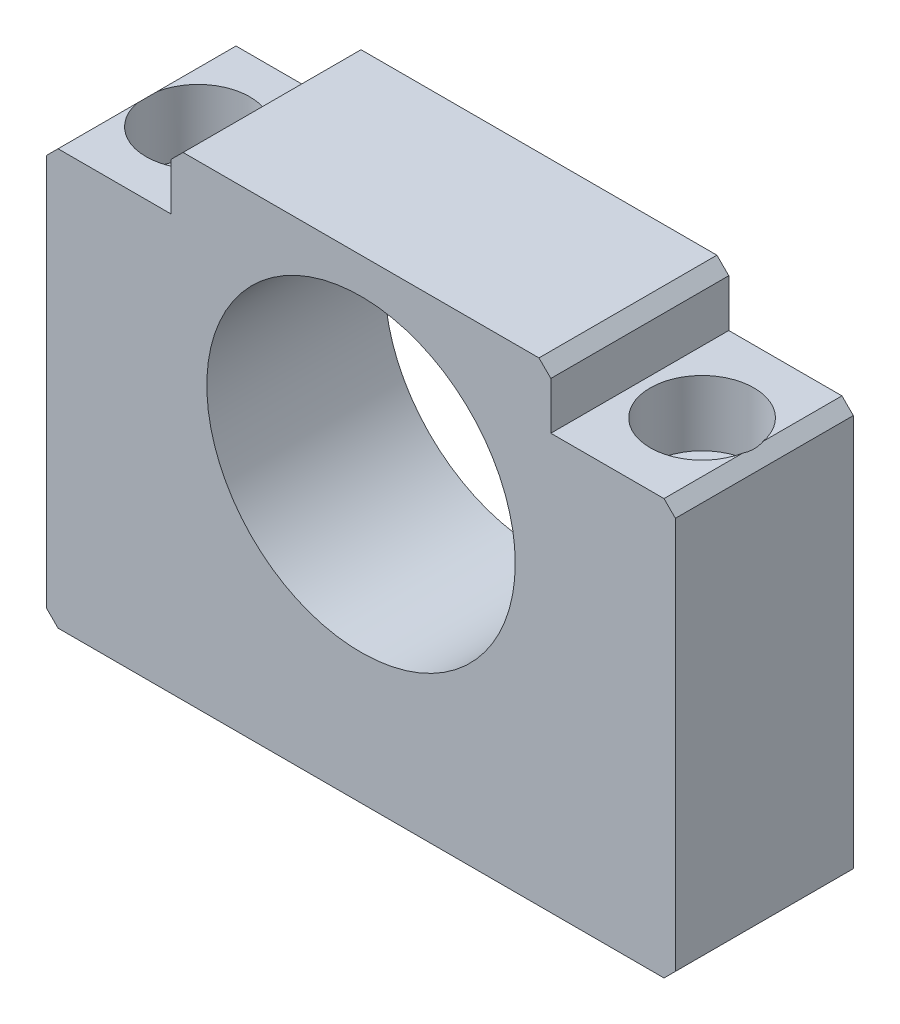
ISO-10303-21;
HEADER;
FILE_DESCRIPTION(('STEP AP214'),'2;1');
FILE_NAME('part.step','',(''),(''),'','','');
FILE_SCHEMA(('AUTOMOTIVE_DESIGN { 1 0 10303 214 1 1 1 1 }'));
ENDSEC;
DATA;
#1=APPLICATION_CONTEXT('core data for automotive mechanical design processes');
#2=APPLICATION_PROTOCOL_DEFINITION('international standard','automotive_design',2000,#1);
#3=PRODUCT_CONTEXT('',#1,'mechanical');
#4=PRODUCT('Part','Part','',(#3));
#5=PRODUCT_RELATED_PRODUCT_CATEGORY('part','',(#4));
#6=PRODUCT_DEFINITION_FORMATION('','',#4);
#7=PRODUCT_DEFINITION_CONTEXT('part definition',#1,'design');
#8=PRODUCT_DEFINITION('design','',#6,#7);
#9=PRODUCT_DEFINITION_SHAPE('','',#8);
#10=(LENGTH_UNIT() NAMED_UNIT(*) SI_UNIT(.MILLI.,.METRE.));
#11=(NAMED_UNIT(*) PLANE_ANGLE_UNIT() SI_UNIT($,.RADIAN.));
#12=(NAMED_UNIT(*) SI_UNIT($,.STERADIAN.) SOLID_ANGLE_UNIT());
#13=UNCERTAINTY_MEASURE_WITH_UNIT(LENGTH_MEASURE(1.E-05),#10,'distance_accuracy_value','');
#14=(GEOMETRIC_REPRESENTATION_CONTEXT(3) GLOBAL_UNCERTAINTY_ASSIGNED_CONTEXT((#13)) GLOBAL_UNIT_ASSIGNED_CONTEXT((#10,
#11,#12)) REPRESENTATION_CONTEXT('',''));
#15=CARTESIAN_POINT('',(0.,0.,0.));
#16=DIRECTION('',(0.,0.,1.));
#17=DIRECTION('',(1.,0.,0.));
#18=AXIS2_PLACEMENT_3D('',#15,#16,#17);
#19=CARTESIAN_POINT('',(-51.08,-48.,-30.));
#20=DIRECTION('',(0.,-1.,0.));
#21=DIRECTION('',(0.,0.,-1.));
#22=AXIS2_PLACEMENT_3D('',#19,#20,#21);
#23=PLANE('',#22);
#24=CARTESIAN_POINT('',(42.5,-48.,-15.));
#25=DIRECTION('',(0.,1.,0.));
#26=DIRECTION('',(0.,0.,1.));
#27=AXIS2_PLACEMENT_3D('',#24,#25,#26);
#28=CIRCLE('',#27,5.5);
#29=CARTESIAN_POINT('',(42.5,-48.,-9.5));
#30=VERTEX_POINT('',#29);
#31=EDGE_CURVE('E155',#30,#30,#28,.T.);
#32=ORIENTED_EDGE('',*,*,#31,.T.);
#33=EDGE_LOOP('',(#32));
#34=FACE_BOUND('',#33,.T.);
#35=DIRECTION('',(1.,0.,0.));
#36=VECTOR('',#35,1.);
#37=CARTESIAN_POINT('',(-51.08,-48.,0.));
#38=LINE('',#37,#36);
#39=CARTESIAN_POINT('',(-51.08,-48.,0.));
#40=VERTEX_POINT('',#39);
#41=CARTESIAN_POINT('',(51.08,-48.,0.));
#42=VERTEX_POINT('',#41);
#43=EDGE_CURVE('E285',#40,#42,#38,.T.);
#44=ORIENTED_EDGE('',*,*,#43,.F.);
#45=DIRECTION('',(0.,0.,1.));
#46=VECTOR('',#45,1.);
#47=CARTESIAN_POINT('',(-51.08,-48.,-30.));
#48=LINE('',#47,#46);
#49=CARTESIAN_POINT('',(-51.08,-48.,-30.));
#50=VERTEX_POINT('',#49);
#51=EDGE_CURVE('E189',#50,#40,#48,.T.);
#52=ORIENTED_EDGE('',*,*,#51,.F.);
#53=DIRECTION('',(1.,0.,0.));
#54=VECTOR('',#53,1.);
#55=CARTESIAN_POINT('',(-51.08,-48.,-30.));
#56=LINE('',#55,#54);
#57=CARTESIAN_POINT('',(51.08,-48.,-30.));
#58=VERTEX_POINT('',#57);
#59=EDGE_CURVE('E246',#50,#58,#56,.T.);
#60=ORIENTED_EDGE('',*,*,#59,.T.);
#61=DIRECTION('',(0.,0.,1.));
#62=VECTOR('',#61,1.);
#63=CARTESIAN_POINT('',(51.08,-48.,-30.));
#64=LINE('',#63,#62);
#65=EDGE_CURVE('E187',#58,#42,#64,.T.);
#66=ORIENTED_EDGE('',*,*,#65,.T.);
#67=EDGE_LOOP('',(#44,#52,#60,#66));
#68=FACE_BOUND('',#67,.T.);
#69=CARTESIAN_POINT('',(-42.5,-48.,-15.));
#70=DIRECTION('',(0.,1.,0.));
#71=DIRECTION('',(0.,0.,1.));
#72=AXIS2_PLACEMENT_3D('',#69,#70,#71);
#73=CIRCLE('',#72,5.5);
#74=CARTESIAN_POINT('',(-42.5,-48.,-9.5));
#75=VERTEX_POINT('',#74);
#76=EDGE_CURVE('E332',#75,#75,#73,.T.);
#77=ORIENTED_EDGE('',*,*,#76,.T.);
#78=EDGE_LOOP('',(#77));
#79=FACE_BOUND('',#78,.T.);
#80=ADVANCED_FACE('F34',(#34,#68,#79),#23,.T.);
#81=CARTESIAN_POINT('',(-51.08,22.,-30.));
#82=DIRECTION('',(-0.707106781186547,0.707106781186547,0.));
#83=DIRECTION('',(-0.707106781186548,-0.707106781186548,0.));
#84=AXIS2_PLACEMENT_3D('',#81,#82,#83);
#85=PLANE('',#84);
#86=DIRECTION('',(0.,0.,1.));
#87=VECTOR('',#86,1.);
#88=CARTESIAN_POINT('',(-51.08,22.,-30.));
#89=LINE('',#88,#87);
#90=CARTESIAN_POINT('',(-51.08,22.,-13.2835793056479));
#91=VERTEX_POINT('',#90);
#92=CARTESIAN_POINT('',(-51.08,22.,0.));
#93=VERTEX_POINT('',#92);
#94=EDGE_CURVE('E154',#91,#93,#89,.T.);
#95=ORIENTED_EDGE('',*,*,#94,.F.);
#96=CARTESIAN_POINT('',(-42.5,30.58,-15.));
#97=DIRECTION('',(-0.707106781186547,0.707106781186547,0.));
#98=DIRECTION('',(0.707106781186548,0.707106781186548,0.));
#99=AXIS2_PLACEMENT_3D('',#96,#97,#98);
#100=ELLIPSE('',#99,12.3743686707646,8.75);
#101=CARTESIAN_POINT('',(-51.08,22.,-16.7164206943521));
#102=VERTEX_POINT('',#101);
#103=EDGE_CURVE('E48',#91,#102,#100,.F.);
#104=ORIENTED_EDGE('',*,*,#103,.T.);
#105=CARTESIAN_POINT('',(-51.08,22.,-30.));
#106=VERTEX_POINT('',#105);
#107=EDGE_CURVE('E151',#106,#102,#89,.T.);
#108=ORIENTED_EDGE('',*,*,#107,.F.);
#109=DIRECTION('',(-0.707106781186548,-0.707106781186548,0.));
#110=VECTOR('',#109,1.);
#111=CARTESIAN_POINT('',(-51.08,22.,-30.));
#112=LINE('',#111,#110);
#113=CARTESIAN_POINT('',(-53.,20.08,-30.));
#114=VERTEX_POINT('',#113);
#115=EDGE_CURVE('E192',#106,#114,#112,.T.);
#116=ORIENTED_EDGE('',*,*,#115,.T.);
#117=DIRECTION('',(0.,0.,1.));
#118=VECTOR('',#117,1.);
#119=CARTESIAN_POINT('',(-53.,20.08,-30.));
#120=LINE('',#119,#118);
#121=CARTESIAN_POINT('',(-53.,20.08,0.));
#122=VERTEX_POINT('',#121);
#123=EDGE_CURVE('E162',#114,#122,#120,.T.);
#124=ORIENTED_EDGE('',*,*,#123,.T.);
#125=DIRECTION('',(-0.707106781186548,-0.707106781186548,0.));
#126=VECTOR('',#125,1.);
#127=CARTESIAN_POINT('',(-51.08,22.,0.));
#128=LINE('',#127,#126);
#129=EDGE_CURVE('E237',#93,#122,#128,.T.);
#130=ORIENTED_EDGE('',*,*,#129,.F.);
#131=EDGE_LOOP('',(#95,#104,#108,#116,#124,#130));
#132=FACE_BOUND('',#131,.T.);
#133=ADVANCED_FACE('F149',(#132),#85,.T.);
#134=CARTESIAN_POINT('',(-32.,22.,-30.));
#135=DIRECTION('',(0.,1.,0.));
#136=DIRECTION('',(0.,0.,1.));
#137=AXIS2_PLACEMENT_3D('',#134,#135,#136);
#138=PLANE('',#137);
#139=ORIENTED_EDGE('',*,*,#107,.T.);
#140=CARTESIAN_POINT('',(-42.5,22.,-15.));
#141=DIRECTION('',(0.,1.,0.));
#142=DIRECTION('',(0.,0.,1.));
#143=AXIS2_PLACEMENT_3D('',#140,#141,#142);
#144=CIRCLE('',#143,8.75);
#145=EDGE_CURVE('E11',#102,#91,#144,.F.);
#146=ORIENTED_EDGE('',*,*,#145,.T.);
#147=ORIENTED_EDGE('',*,*,#94,.T.);
#148=DIRECTION('',(-1.,0.,0.));
#149=VECTOR('',#148,1.);
#150=CARTESIAN_POINT('',(-32.,22.,0.));
#151=LINE('',#150,#149);
#152=CARTESIAN_POINT('',(-32.,22.,0.));
#153=VERTEX_POINT('',#152);
#154=EDGE_CURVE('E235',#153,#93,#151,.T.);
#155=ORIENTED_EDGE('',*,*,#154,.F.);
#156=DIRECTION('',(0.,0.,1.));
#157=VECTOR('',#156,1.);
#158=CARTESIAN_POINT('',(-32.,22.,-30.));
#159=LINE('',#158,#157);
#160=CARTESIAN_POINT('',(-32.,22.,-30.));
#161=VERTEX_POINT('',#160);
#162=EDGE_CURVE('E165',#161,#153,#159,.T.);
#163=ORIENTED_EDGE('',*,*,#162,.F.);
#164=DIRECTION('',(-1.,0.,0.));
#165=VECTOR('',#164,1.);
#166=CARTESIAN_POINT('',(-32.,22.,-30.));
#167=LINE('',#166,#165);
#168=EDGE_CURVE('E160',#161,#106,#167,.T.);
#169=ORIENTED_EDGE('',*,*,#168,.T.);
#170=EDGE_LOOP('',(#139,#146,#147,#155,#163,#169));
#171=FACE_BOUND('',#170,.T.);
#172=ADVANCED_FACE('F158',(#171),#138,.T.);
#173=CARTESIAN_POINT('',(51.08,22.,-30.));
#174=DIRECTION('',(0.,1.,0.));
#175=DIRECTION('',(0.,0.,1.));
#176=AXIS2_PLACEMENT_3D('',#173,#174,#175);
#177=PLANE('',#176);
#178=DIRECTION('',(0.,0.,1.));
#179=VECTOR('',#178,1.);
#180=CARTESIAN_POINT('',(51.08,22.,-30.));
#181=LINE('',#180,#179);
#182=CARTESIAN_POINT('',(51.08,22.,-13.2835793056479));
#183=VERTEX_POINT('',#182);
#184=CARTESIAN_POINT('',(51.08,22.,0.));
#185=VERTEX_POINT('',#184);
#186=EDGE_CURVE('E182',#183,#185,#181,.T.);
#187=ORIENTED_EDGE('',*,*,#186,.F.);
#188=CARTESIAN_POINT('',(42.5,22.,-15.));
#189=DIRECTION('',(0.,1.,0.));
#190=DIRECTION('',(0.,0.,1.));
#191=AXIS2_PLACEMENT_3D('',#188,#189,#190);
#192=CIRCLE('',#191,8.75);
#193=CARTESIAN_POINT('',(51.08,22.,-16.7164206943521));
#194=VERTEX_POINT('',#193);
#195=EDGE_CURVE('E54',#194,#183,#192,.T.);
#196=ORIENTED_EDGE('',*,*,#195,.F.);
#197=CARTESIAN_POINT('',(51.08,22.,-30.));
#198=VERTEX_POINT('',#197);
#199=EDGE_CURVE('E179',#198,#194,#181,.T.);
#200=ORIENTED_EDGE('',*,*,#199,.F.);
#201=DIRECTION('',(-1.,0.,0.));
#202=VECTOR('',#201,1.);
#203=CARTESIAN_POINT('',(51.08,22.,-30.));
#204=LINE('',#203,#202);
#205=CARTESIAN_POINT('',(32.,22.,-30.));
#206=VERTEX_POINT('',#205);
#207=EDGE_CURVE('E261',#198,#206,#204,.T.);
#208=ORIENTED_EDGE('',*,*,#207,.T.);
#209=DIRECTION('',(0.,0.,1.));
#210=VECTOR('',#209,1.);
#211=CARTESIAN_POINT('',(32.,22.,-30.));
#212=LINE('',#211,#210);
#213=CARTESIAN_POINT('',(32.,22.,0.));
#214=VERTEX_POINT('',#213);
#215=EDGE_CURVE('E177',#206,#214,#212,.T.);
#216=ORIENTED_EDGE('',*,*,#215,.T.);
#217=DIRECTION('',(-1.,0.,0.));
#218=VECTOR('',#217,1.);
#219=CARTESIAN_POINT('',(51.08,22.,0.));
#220=LINE('',#219,#218);
#221=EDGE_CURVE('E202',#185,#214,#220,.T.);
#222=ORIENTED_EDGE('',*,*,#221,.F.);
#223=EDGE_LOOP('',(#187,#196,#200,#208,#216,#222));
#224=FACE_BOUND('',#223,.T.);
#225=ADVANCED_FACE('F200',(#224),#177,.T.);
#226=CARTESIAN_POINT('',(53.,20.08,-30.));
#227=DIRECTION('',(0.707106781186547,0.707106781186547,0.));
#228=DIRECTION('',(-0.707106781186548,0.707106781186548,0.));
#229=AXIS2_PLACEMENT_3D('',#226,#227,#228);
#230=PLANE('',#229);
#231=ORIENTED_EDGE('',*,*,#199,.T.);
#232=CARTESIAN_POINT('',(42.5,30.58,-15.));
#233=DIRECTION('',(0.707106781186547,0.707106781186547,0.));
#234=DIRECTION('',(-0.707106781186548,0.707106781186548,0.));
#235=AXIS2_PLACEMENT_3D('',#232,#233,#234);
#236=ELLIPSE('',#235,12.3743686707646,8.75);
#237=EDGE_CURVE('E42',#194,#183,#236,.F.);
#238=ORIENTED_EDGE('',*,*,#237,.T.);
#239=ORIENTED_EDGE('',*,*,#186,.T.);
#240=DIRECTION('',(-0.707106781186548,0.707106781186548,0.));
#241=VECTOR('',#240,1.);
#242=CARTESIAN_POINT('',(53.,20.08,0.));
#243=LINE('',#242,#241);
#244=CARTESIAN_POINT('',(53.,20.08,0.));
#245=VERTEX_POINT('',#244);
#246=EDGE_CURVE('E209',#245,#185,#243,.T.);
#247=ORIENTED_EDGE('',*,*,#246,.F.);
#248=DIRECTION('',(0.,0.,1.));
#249=VECTOR('',#248,1.);
#250=CARTESIAN_POINT('',(53.,20.08,-30.));
#251=LINE('',#250,#249);
#252=CARTESIAN_POINT('',(53.,20.08,-30.));
#253=VERTEX_POINT('',#252);
#254=EDGE_CURVE('E183',#253,#245,#251,.T.);
#255=ORIENTED_EDGE('',*,*,#254,.F.);
#256=DIRECTION('',(-0.707106781186548,0.707106781186548,0.));
#257=VECTOR('',#256,1.);
#258=CARTESIAN_POINT('',(53.,20.08,-30.));
#259=LINE('',#258,#257);
#260=EDGE_CURVE('E259',#253,#198,#259,.T.);
#261=ORIENTED_EDGE('',*,*,#260,.T.);
#262=EDGE_LOOP('',(#231,#238,#239,#247,#255,#261));
#263=FACE_BOUND('',#262,.T.);
#264=ADVANCED_FACE('F195',(#263),#230,.T.);
#265=CARTESIAN_POINT('',(-53.,20.08,-30.));
#266=DIRECTION('',(-1.,0.,0.));
#267=DIRECTION('',(0.,0.,1.));
#268=AXIS2_PLACEMENT_3D('',#265,#266,#267);
#269=PLANE('',#268);
#270=DIRECTION('',(0.,-1.,0.));
#271=VECTOR('',#270,1.);
#272=CARTESIAN_POINT('',(-53.,20.08,0.));
#273=LINE('',#272,#271);
#274=CARTESIAN_POINT('',(-53.,-46.08,0.));
#275=VERTEX_POINT('',#274);
#276=EDGE_CURVE('E280',#122,#275,#273,.T.);
#277=ORIENTED_EDGE('',*,*,#276,.F.);
#278=ORIENTED_EDGE('',*,*,#123,.F.);
#279=DIRECTION('',(0.,-1.,0.));
#280=VECTOR('',#279,1.);
#281=CARTESIAN_POINT('',(-53.,20.08,-30.));
#282=LINE('',#281,#280);
#283=CARTESIAN_POINT('',(-53.,-46.08,-30.));
#284=VERTEX_POINT('',#283);
#285=EDGE_CURVE('E239',#114,#284,#282,.T.);
#286=ORIENTED_EDGE('',*,*,#285,.T.);
#287=DIRECTION('',(0.,0.,1.));
#288=VECTOR('',#287,1.);
#289=CARTESIAN_POINT('',(-53.,-46.08,-30.));
#290=LINE('',#289,#288);
#291=EDGE_CURVE('E191',#284,#275,#290,.T.);
#292=ORIENTED_EDGE('',*,*,#291,.T.);
#293=EDGE_LOOP('',(#277,#278,#286,#292));
#294=FACE_BOUND('',#293,.T.);
#295=ADVANCED_FACE('F36',(#294),#269,.T.);
#296=CARTESIAN_POINT('',(-32.,30.,-30.));
#297=DIRECTION('',(-1.,0.,0.));
#298=DIRECTION('',(0.,0.,1.));
#299=AXIS2_PLACEMENT_3D('',#296,#297,#298);
#300=PLANE('',#299);
#301=DIRECTION('',(0.,-1.,0.));
#302=VECTOR('',#301,1.);
#303=CARTESIAN_POINT('',(-32.,30.,0.));
#304=LINE('',#303,#302);
#305=CARTESIAN_POINT('',(-32.,30.,0.));
#306=VERTEX_POINT('',#305);
#307=EDGE_CURVE('E232',#306,#153,#304,.T.);
#308=ORIENTED_EDGE('',*,*,#307,.F.);
#309=DIRECTION('',(0.,0.,1.));
#310=VECTOR('',#309,1.);
#311=CARTESIAN_POINT('',(-32.,30.,-30.));
#312=LINE('',#311,#310);
#313=CARTESIAN_POINT('',(-32.,30.,-30.));
#314=VERTEX_POINT('',#313);
#315=EDGE_CURVE('E169',#314,#306,#312,.T.);
#316=ORIENTED_EDGE('',*,*,#315,.F.);
#317=DIRECTION('',(0.,-1.,0.));
#318=VECTOR('',#317,1.);
#319=CARTESIAN_POINT('',(-32.,30.,-30.));
#320=LINE('',#319,#318);
#321=EDGE_CURVE('E275',#314,#161,#320,.T.);
#322=ORIENTED_EDGE('',*,*,#321,.T.);
#323=ORIENTED_EDGE('',*,*,#162,.T.);
#324=EDGE_LOOP('',(#308,#316,#322,#323));
#325=FACE_BOUND('',#324,.T.);
#326=ADVANCED_FACE('F317',(#325),#300,.T.);
#327=CARTESIAN_POINT('',(-30.,32.,-30.));
#328=DIRECTION('',(-0.707106781186547,0.707106781186547,0.));
#329=DIRECTION('',(-0.707106781186548,-0.707106781186548,0.));
#330=AXIS2_PLACEMENT_3D('',#327,#328,#329);
#331=PLANE('',#330);
#332=DIRECTION('',(-0.707106781186547,-0.707106781186547,0.));
#333=VECTOR('',#332,1.);
#334=CARTESIAN_POINT('',(-30.,32.,0.));
#335=LINE('',#334,#333);
#336=CARTESIAN_POINT('',(-30.,32.,0.));
#337=VERTEX_POINT('',#336);
#338=EDGE_CURVE('E229',#337,#306,#335,.T.);
#339=ORIENTED_EDGE('',*,*,#338,.F.);
#340=DIRECTION('',(0.,0.,1.));
#341=VECTOR('',#340,1.);
#342=CARTESIAN_POINT('',(-30.,32.,-30.));
#343=LINE('',#342,#341);
#344=CARTESIAN_POINT('',(-30.,32.,-30.));
#345=VERTEX_POINT('',#344);
#346=EDGE_CURVE('E171',#345,#337,#343,.T.);
#347=ORIENTED_EDGE('',*,*,#346,.F.);
#348=DIRECTION('',(-0.707106781186547,-0.707106781186547,0.));
#349=VECTOR('',#348,1.);
#350=CARTESIAN_POINT('',(-30.,32.,-30.));
#351=LINE('',#350,#349);
#352=EDGE_CURVE('E272',#345,#314,#351,.T.);
#353=ORIENTED_EDGE('',*,*,#352,.T.);
#354=ORIENTED_EDGE('',*,*,#315,.T.);
#355=EDGE_LOOP('',(#339,#347,#353,#354));
#356=FACE_BOUND('',#355,.T.);
#357=ADVANCED_FACE('F313',(#356),#331,.T.);
#358=CARTESIAN_POINT('',(30.,32.,-30.));
#359=DIRECTION('',(0.,1.,0.));
#360=DIRECTION('',(0.,0.,1.));
#361=AXIS2_PLACEMENT_3D('',#358,#359,#360);
#362=PLANE('',#361);
#363=DIRECTION('',(-1.,0.,0.));
#364=VECTOR('',#363,1.);
#365=CARTESIAN_POINT('',(30.,32.,0.));
#366=LINE('',#365,#364);
#367=CARTESIAN_POINT('',(30.,32.,0.));
#368=VERTEX_POINT('',#367);
#369=EDGE_CURVE('E226',#368,#337,#366,.T.);
#370=ORIENTED_EDGE('',*,*,#369,.F.);
#371=DIRECTION('',(0.,0.,1.));
#372=VECTOR('',#371,1.);
#373=CARTESIAN_POINT('',(30.,32.,-30.));
#374=LINE('',#373,#372);
#375=CARTESIAN_POINT('',(30.,32.,-30.));
#376=VERTEX_POINT('',#375);
#377=EDGE_CURVE('E173',#376,#368,#374,.T.);
#378=ORIENTED_EDGE('',*,*,#377,.F.);
#379=DIRECTION('',(-1.,0.,0.));
#380=VECTOR('',#379,1.);
#381=CARTESIAN_POINT('',(30.,32.,-30.));
#382=LINE('',#381,#380);
#383=EDGE_CURVE('E269',#376,#345,#382,.T.);
#384=ORIENTED_EDGE('',*,*,#383,.T.);
#385=ORIENTED_EDGE('',*,*,#346,.T.);
#386=EDGE_LOOP('',(#370,#378,#384,#385));
#387=FACE_BOUND('',#386,.T.);
#388=ADVANCED_FACE('F309',(#387),#362,.T.);
#389=CARTESIAN_POINT('',(32.,30.,-30.));
#390=DIRECTION('',(0.707106781186547,0.707106781186547,0.));
#391=DIRECTION('',(-0.707106781186548,0.707106781186548,0.));
#392=AXIS2_PLACEMENT_3D('',#389,#390,#391);
#393=PLANE('',#392);
#394=DIRECTION('',(-0.707106781186547,0.707106781186547,0.));
#395=VECTOR('',#394,1.);
#396=CARTESIAN_POINT('',(32.,30.,0.));
#397=LINE('',#396,#395);
#398=CARTESIAN_POINT('',(32.,30.,0.));
#399=VERTEX_POINT('',#398);
#400=EDGE_CURVE('E223',#399,#368,#397,.T.);
#401=ORIENTED_EDGE('',*,*,#400,.F.);
#402=DIRECTION('',(0.,0.,1.));
#403=VECTOR('',#402,1.);
#404=CARTESIAN_POINT('',(32.,30.,-30.));
#405=LINE('',#404,#403);
#406=CARTESIAN_POINT('',(32.,30.,-30.));
#407=VERTEX_POINT('',#406);
#408=EDGE_CURVE('E175',#407,#399,#405,.T.);
#409=ORIENTED_EDGE('',*,*,#408,.F.);
#410=DIRECTION('',(-0.707106781186547,0.707106781186547,0.));
#411=VECTOR('',#410,1.);
#412=CARTESIAN_POINT('',(32.,30.,-30.));
#413=LINE('',#412,#411);
#414=EDGE_CURVE('E266',#407,#376,#413,.T.);
#415=ORIENTED_EDGE('',*,*,#414,.T.);
#416=ORIENTED_EDGE('',*,*,#377,.T.);
#417=EDGE_LOOP('',(#401,#409,#415,#416));
#418=FACE_BOUND('',#417,.T.);
#419=ADVANCED_FACE('F307',(#418),#393,.T.);
#420=CARTESIAN_POINT('',(32.,22.,-30.));
#421=DIRECTION('',(1.,0.,0.));
#422=DIRECTION('',(0.,0.,-1.));
#423=AXIS2_PLACEMENT_3D('',#420,#421,#422);
#424=PLANE('',#423);
#425=DIRECTION('',(0.,1.,0.));
#426=VECTOR('',#425,1.);
#427=CARTESIAN_POINT('',(32.,22.,0.));
#428=LINE('',#427,#426);
#429=EDGE_CURVE('E208',#214,#399,#428,.T.);
#430=ORIENTED_EDGE('',*,*,#429,.F.);
#431=ORIENTED_EDGE('',*,*,#215,.F.);
#432=DIRECTION('',(0.,1.,0.));
#433=VECTOR('',#432,1.);
#434=CARTESIAN_POINT('',(32.,22.,-30.));
#435=LINE('',#434,#433);
#436=EDGE_CURVE('E263',#206,#407,#435,.T.);
#437=ORIENTED_EDGE('',*,*,#436,.T.);
#438=ORIENTED_EDGE('',*,*,#408,.T.);
#439=EDGE_LOOP('',(#430,#431,#437,#438));
#440=FACE_BOUND('',#439,.T.);
#441=ADVANCED_FACE('F303',(#440),#424,.T.);
#442=CARTESIAN_POINT('',(53.,-46.08,-30.));
#443=DIRECTION('',(1.,0.,0.));
#444=DIRECTION('',(0.,0.,-1.));
#445=AXIS2_PLACEMENT_3D('',#442,#443,#444);
#446=PLANE('',#445);
#447=DIRECTION('',(0.,1.,0.));
#448=VECTOR('',#447,1.);
#449=CARTESIAN_POINT('',(53.,-46.08,0.));
#450=LINE('',#449,#448);
#451=CARTESIAN_POINT('',(53.,-46.08,0.));
#452=VERTEX_POINT('',#451);
#453=EDGE_CURVE('E216',#452,#245,#450,.T.);
#454=ORIENTED_EDGE('',*,*,#453,.F.);
#455=DIRECTION('',(0.,0.,1.));
#456=VECTOR('',#455,1.);
#457=CARTESIAN_POINT('',(53.,-46.08,-30.));
#458=LINE('',#457,#456);
#459=CARTESIAN_POINT('',(53.,-46.08,-30.));
#460=VERTEX_POINT('',#459);
#461=EDGE_CURVE('E185',#460,#452,#458,.T.);
#462=ORIENTED_EDGE('',*,*,#461,.F.);
#463=DIRECTION('',(0.,1.,0.));
#464=VECTOR('',#463,1.);
#465=CARTESIAN_POINT('',(53.,-46.08,-30.));
#466=LINE('',#465,#464);
#467=EDGE_CURVE('E256',#460,#253,#466,.T.);
#468=ORIENTED_EDGE('',*,*,#467,.T.);
#469=ORIENTED_EDGE('',*,*,#254,.T.);
#470=EDGE_LOOP('',(#454,#462,#468,#469));
#471=FACE_BOUND('',#470,.T.);
#472=ADVANCED_FACE('F294',(#471),#446,.T.);
#473=CARTESIAN_POINT('',(51.08,-48.,-30.));
#474=DIRECTION('',(0.707106781186547,-0.707106781186547,0.));
#475=DIRECTION('',(0.707106781186548,0.707106781186548,0.));
#476=AXIS2_PLACEMENT_3D('',#473,#474,#475);
#477=PLANE('',#476);
#478=DIRECTION('',(0.707106781186548,0.707106781186548,0.));
#479=VECTOR('',#478,1.);
#480=CARTESIAN_POINT('',(51.08,-48.,0.));
#481=LINE('',#480,#479);
#482=EDGE_CURVE('E218',#42,#452,#481,.T.);
#483=ORIENTED_EDGE('',*,*,#482,.F.);
#484=ORIENTED_EDGE('',*,*,#65,.F.);
#485=DIRECTION('',(0.707106781186548,0.707106781186548,0.));
#486=VECTOR('',#485,1.);
#487=CARTESIAN_POINT('',(51.08,-48.,-30.));
#488=LINE('',#487,#486);
#489=EDGE_CURVE('E253',#58,#460,#488,.T.);
#490=ORIENTED_EDGE('',*,*,#489,.T.);
#491=ORIENTED_EDGE('',*,*,#461,.T.);
#492=EDGE_LOOP('',(#483,#484,#490,#491));
#493=FACE_BOUND('',#492,.T.);
#494=ADVANCED_FACE('F290',(#493),#477,.T.);
#495=CARTESIAN_POINT('',(-53.,-46.08,-30.));
#496=DIRECTION('',(-0.707106781186547,-0.707106781186547,0.));
#497=DIRECTION('',(0.707106781186548,-0.707106781186548,0.));
#498=AXIS2_PLACEMENT_3D('',#495,#496,#497);
#499=PLANE('',#498);
#500=DIRECTION('',(0.707106781186548,-0.707106781186548,0.));
#501=VECTOR('',#500,1.);
#502=CARTESIAN_POINT('',(-53.,-46.08,0.));
#503=LINE('',#502,#501);
#504=EDGE_CURVE('E282',#275,#40,#503,.T.);
#505=ORIENTED_EDGE('',*,*,#504,.F.);
#506=ORIENTED_EDGE('',*,*,#291,.F.);
#507=DIRECTION('',(0.707106781186548,-0.707106781186548,0.));
#508=VECTOR('',#507,1.);
#509=CARTESIAN_POINT('',(-53.,-46.08,-30.));
#510=LINE('',#509,#508);
#511=EDGE_CURVE('E241',#284,#50,#510,.T.);
#512=ORIENTED_EDGE('',*,*,#511,.T.);
#513=ORIENTED_EDGE('',*,*,#51,.T.);
#514=EDGE_LOOP('',(#505,#506,#512,#513));
#515=FACE_BOUND('',#514,.T.);
#516=ADVANCED_FACE('F323',(#515),#499,.T.);
#517=CARTESIAN_POINT('',(0.,0.,-30.));
#518=DIRECTION('',(0.,0.,1.));
#519=DIRECTION('',(1.,0.,0.));
#520=AXIS2_PLACEMENT_3D('',#517,#518,#519);
#521=PLANE('',#520);
#522=CARTESIAN_POINT('',(0.,0.,-30.));
#523=DIRECTION('',(0.,0.,1.));
#524=DIRECTION('',(1.,0.,0.));
#525=AXIS2_PLACEMENT_3D('',#522,#523,#524);
#526=CIRCLE('',#525,26.);
#527=CARTESIAN_POINT('',(26.,0.,-30.));
#528=VERTEX_POINT('',#527);
#529=EDGE_CURVE('E335',#528,#528,#526,.T.);
#530=ORIENTED_EDGE('',*,*,#529,.T.);
#531=EDGE_LOOP('',(#530));
#532=FACE_BOUND('',#531,.T.);
#533=ORIENTED_EDGE('',*,*,#285,.F.);
#534=ORIENTED_EDGE('',*,*,#115,.F.);
#535=ORIENTED_EDGE('',*,*,#168,.F.);
#536=ORIENTED_EDGE('',*,*,#321,.F.);
#537=ORIENTED_EDGE('',*,*,#352,.F.);
#538=ORIENTED_EDGE('',*,*,#383,.F.);
#539=ORIENTED_EDGE('',*,*,#414,.F.);
#540=ORIENTED_EDGE('',*,*,#436,.F.);
#541=ORIENTED_EDGE('',*,*,#207,.F.);
#542=ORIENTED_EDGE('',*,*,#260,.F.);
#543=ORIENTED_EDGE('',*,*,#467,.F.);
#544=ORIENTED_EDGE('',*,*,#489,.F.);
#545=ORIENTED_EDGE('',*,*,#59,.F.);
#546=ORIENTED_EDGE('',*,*,#511,.F.);
#547=EDGE_LOOP('',(#533,#534,#535,#536,#537,#538,#539,#540,#541,#542,#543,#544,#545,#546));
#548=FACE_BOUND('',#547,.T.);
#549=ADVANCED_FACE('F298',(#532,#548),#521,.F.);
#550=CARTESIAN_POINT('',(0.,0.,0.));
#551=DIRECTION('',(0.,0.,1.));
#552=DIRECTION('',(1.,0.,0.));
#553=AXIS2_PLACEMENT_3D('',#550,#551,#552);
#554=PLANE('',#553);
#555=CARTESIAN_POINT('',(0.,0.,0.));
#556=DIRECTION('',(0.,0.,1.));
#557=DIRECTION('',(1.,0.,0.));
#558=AXIS2_PLACEMENT_3D('',#555,#556,#557);
#559=CIRCLE('',#558,26.);
#560=CARTESIAN_POINT('',(26.,0.,0.));
#561=VERTEX_POINT('',#560);
#562=EDGE_CURVE('E340',#561,#561,#559,.T.);
#563=ORIENTED_EDGE('',*,*,#562,.F.);
#564=EDGE_LOOP('',(#563));
#565=FACE_BOUND('',#564,.T.);
#566=ORIENTED_EDGE('',*,*,#276,.T.);
#567=ORIENTED_EDGE('',*,*,#504,.T.);
#568=ORIENTED_EDGE('',*,*,#43,.T.);
#569=ORIENTED_EDGE('',*,*,#482,.T.);
#570=ORIENTED_EDGE('',*,*,#453,.T.);
#571=ORIENTED_EDGE('',*,*,#246,.T.);
#572=ORIENTED_EDGE('',*,*,#221,.T.);
#573=ORIENTED_EDGE('',*,*,#429,.T.);
#574=ORIENTED_EDGE('',*,*,#400,.T.);
#575=ORIENTED_EDGE('',*,*,#369,.T.);
#576=ORIENTED_EDGE('',*,*,#338,.T.);
#577=ORIENTED_EDGE('',*,*,#307,.T.);
#578=ORIENTED_EDGE('',*,*,#154,.T.);
#579=ORIENTED_EDGE('',*,*,#129,.T.);
#580=EDGE_LOOP('',(#566,#567,#568,#569,#570,#571,#572,#573,#574,#575,#576,#577,#578,#579));
#581=FACE_BOUND('',#580,.T.);
#582=ADVANCED_FACE('F213',(#565,#581),#554,.T.);
#583=CARTESIAN_POINT('',(42.5,-48.,-15.));
#584=DIRECTION('',(0.,1.,0.));
#585=DIRECTION('',(0.,0.,1.));
#586=AXIS2_PLACEMENT_3D('',#583,#584,#585);
#587=CYLINDRICAL_SURFACE('',#586,8.75);
#588=ORIENTED_EDGE('',*,*,#195,.T.);
#589=ORIENTED_EDGE('',*,*,#237,.F.);
#590=EDGE_LOOP('',(#588,#589));
#591=FACE_BOUND('',#590,.T.);
#592=CARTESIAN_POINT('',(42.5,11.,-15.));
#593=DIRECTION('',(0.,1.,0.));
#594=DIRECTION('',(0.,0.,1.));
#595=AXIS2_PLACEMENT_3D('',#592,#593,#594);
#596=CIRCLE('',#595,8.75);
#597=CARTESIAN_POINT('',(42.5,11.,-6.25));
#598=VERTEX_POINT('',#597);
#599=EDGE_CURVE('E350',#598,#598,#596,.T.);
#600=ORIENTED_EDGE('',*,*,#599,.F.);
#601=EDGE_LOOP('',(#600));
#602=FACE_BOUND('',#601,.T.);
#603=ADVANCED_FACE('F357',(#591,#602),#587,.F.);
#604=CARTESIAN_POINT('',(42.5,11.,-23.75));
#605=DIRECTION('',(0.,1.,0.));
#606=DIRECTION('',(0.,0.,1.));
#607=AXIS2_PLACEMENT_3D('',#604,#605,#606);
#608=PLANE('',#607);
#609=ORIENTED_EDGE('',*,*,#599,.T.);
#610=EDGE_LOOP('',(#609));
#611=FACE_BOUND('',#610,.T.);
#612=CARTESIAN_POINT('',(42.5,11.,-15.));
#613=DIRECTION('',(0.,1.,0.));
#614=DIRECTION('',(0.,0.,1.));
#615=AXIS2_PLACEMENT_3D('',#612,#613,#614);
#616=CIRCLE('',#615,5.5);
#617=CARTESIAN_POINT('',(42.5,11.,-9.5));
#618=VERTEX_POINT('',#617);
#619=EDGE_CURVE('E348',#618,#618,#616,.T.);
#620=ORIENTED_EDGE('',*,*,#619,.F.);
#621=EDGE_LOOP('',(#620));
#622=FACE_BOUND('',#621,.T.);
#623=ADVANCED_FACE('F354',(#611,#622),#608,.T.);
#624=CARTESIAN_POINT('',(42.5,-48.,-15.));
#625=DIRECTION('',(0.,1.,0.));
#626=DIRECTION('',(0.,0.,1.));
#627=AXIS2_PLACEMENT_3D('',#624,#625,#626);
#628=CYLINDRICAL_SURFACE('',#627,5.5);
#629=ORIENTED_EDGE('',*,*,#619,.T.);
#630=EDGE_LOOP('',(#629));
#631=FACE_BOUND('',#630,.T.);
#632=ORIENTED_EDGE('',*,*,#31,.F.);
#633=EDGE_LOOP('',(#632));
#634=FACE_BOUND('',#633,.T.);
#635=ADVANCED_FACE('F364',(#631,#634),#628,.F.);
#636=CARTESIAN_POINT('',(-42.5,-48.,-15.));
#637=DIRECTION('',(0.,1.,0.));
#638=DIRECTION('',(0.,0.,1.));
#639=AXIS2_PLACEMENT_3D('',#636,#637,#638);
#640=CYLINDRICAL_SURFACE('',#639,8.75);
#641=ORIENTED_EDGE('',*,*,#145,.F.);
#642=ORIENTED_EDGE('',*,*,#103,.F.);
#643=EDGE_LOOP('',(#641,#642));
#644=FACE_BOUND('',#643,.T.);
#645=CARTESIAN_POINT('',(-42.5,11.,-15.));
#646=DIRECTION('',(0.,1.,0.));
#647=DIRECTION('',(0.,0.,1.));
#648=AXIS2_PLACEMENT_3D('',#645,#646,#647);
#649=CIRCLE('',#648,8.75);
#650=CARTESIAN_POINT('',(-42.5,11.,-6.25));
#651=VERTEX_POINT('',#650);
#652=EDGE_CURVE('E156',#651,#651,#649,.T.);
#653=ORIENTED_EDGE('',*,*,#652,.F.);
#654=EDGE_LOOP('',(#653));
#655=FACE_BOUND('',#654,.T.);
#656=ADVANCED_FACE('F143',(#644,#655),#640,.F.);
#657=CARTESIAN_POINT('',(-42.5,11.,-23.75));
#658=DIRECTION('',(0.,1.,0.));
#659=DIRECTION('',(0.,0.,1.));
#660=AXIS2_PLACEMENT_3D('',#657,#658,#659);
#661=PLANE('',#660);
#662=ORIENTED_EDGE('',*,*,#652,.T.);
#663=EDGE_LOOP('',(#662));
#664=FACE_BOUND('',#663,.T.);
#665=CARTESIAN_POINT('',(-42.5,11.,-15.));
#666=DIRECTION('',(0.,1.,0.));
#667=DIRECTION('',(0.,0.,1.));
#668=AXIS2_PLACEMENT_3D('',#665,#666,#667);
#669=CIRCLE('',#668,5.5);
#670=CARTESIAN_POINT('',(-42.5,11.,-9.5));
#671=VERTEX_POINT('',#670);
#672=EDGE_CURVE('E334',#671,#671,#669,.T.);
#673=ORIENTED_EDGE('',*,*,#672,.F.);
#674=EDGE_LOOP('',(#673));
#675=FACE_BOUND('',#674,.T.);
#676=ADVANCED_FACE('F429',(#664,#675),#661,.T.);
#677=CARTESIAN_POINT('',(-42.5,-48.,-15.));
#678=DIRECTION('',(0.,1.,0.));
#679=DIRECTION('',(0.,0.,1.));
#680=AXIS2_PLACEMENT_3D('',#677,#678,#679);
#681=CYLINDRICAL_SURFACE('',#680,5.5);
#682=ORIENTED_EDGE('',*,*,#672,.T.);
#683=EDGE_LOOP('',(#682));
#684=FACE_BOUND('',#683,.T.);
#685=ORIENTED_EDGE('',*,*,#76,.F.);
#686=EDGE_LOOP('',(#685));
#687=FACE_BOUND('',#686,.T.);
#688=ADVANCED_FACE('F419',(#684,#687),#681,.F.);
#689=CARTESIAN_POINT('',(0.,0.,-30.));
#690=DIRECTION('',(0.,0.,1.));
#691=DIRECTION('',(1.,0.,0.));
#692=AXIS2_PLACEMENT_3D('',#689,#690,#691);
#693=CYLINDRICAL_SURFACE('',#692,26.);
#694=ORIENTED_EDGE('',*,*,#529,.F.);
#695=EDGE_LOOP('',(#694));
#696=FACE_BOUND('',#695,.T.);
#697=ORIENTED_EDGE('',*,*,#562,.T.);
#698=EDGE_LOOP('',(#697));
#699=FACE_BOUND('',#698,.T.);
#700=ADVANCED_FACE('F415',(#696,#699),#693,.F.);
#701=CLOSED_SHELL('',(#80,#133,#172,#225,#264,#295,#326,#357,#388,#419,#441,#472,#494,#516,#549,
#582,#603,#623,#635,#656,#676,#688,#700));
#702=MANIFOLD_SOLID_BREP('B2',#701);
#703=ADVANCED_BREP_SHAPE_REPRESENTATION('',(#18,#702),#14);
#704=SHAPE_DEFINITION_REPRESENTATION(#9,#703);
ENDSEC;
END-ISO-10303-21;
